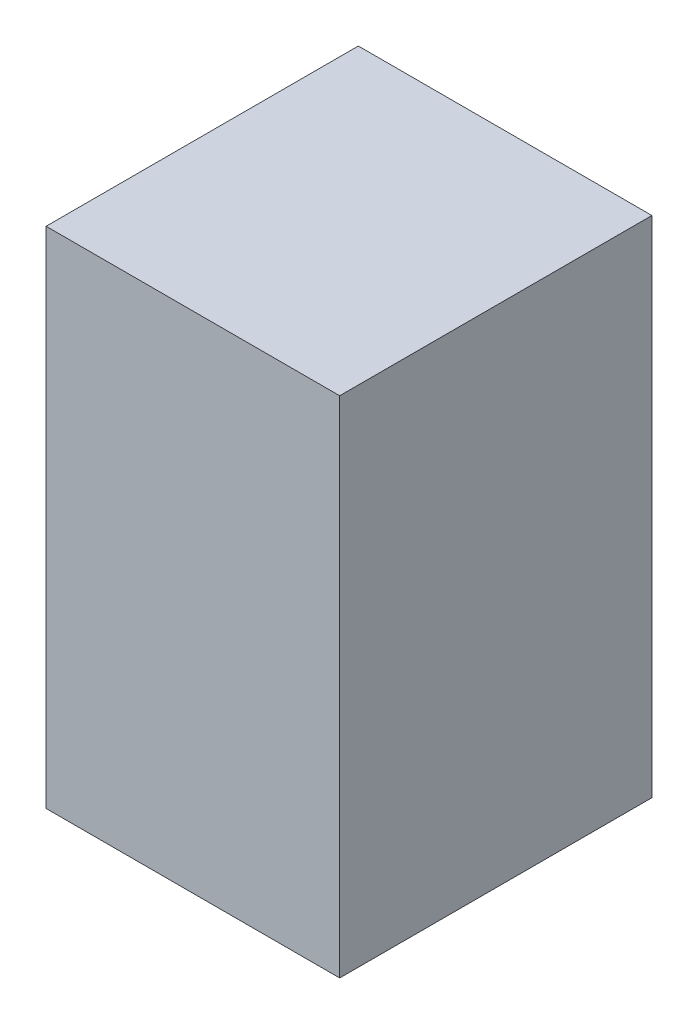
ISO-10303-21;
HEADER;
FILE_DESCRIPTION(('STEP AP214'),'2;1');
FILE_NAME('part.step','',(''),(''),'','','');
FILE_SCHEMA(('AUTOMOTIVE_DESIGN { 1 0 10303 214 1 1 1 1 }'));
ENDSEC;
DATA;
#1=APPLICATION_CONTEXT('core data for automotive mechanical design processes');
#2=APPLICATION_PROTOCOL_DEFINITION('international standard','automotive_design',2000,#1);
#3=PRODUCT_CONTEXT('',#1,'mechanical');
#4=PRODUCT('Part','Part','',(#3));
#5=PRODUCT_RELATED_PRODUCT_CATEGORY('part','',(#4));
#6=PRODUCT_DEFINITION_FORMATION('','',#4);
#7=PRODUCT_DEFINITION_CONTEXT('part definition',#1,'design');
#8=PRODUCT_DEFINITION('design','',#6,#7);
#9=PRODUCT_DEFINITION_SHAPE('','',#8);
#10=(LENGTH_UNIT() NAMED_UNIT(*) SI_UNIT(.MILLI.,.METRE.));
#11=(NAMED_UNIT(*) PLANE_ANGLE_UNIT() SI_UNIT($,.RADIAN.));
#12=(NAMED_UNIT(*) SI_UNIT($,.STERADIAN.) SOLID_ANGLE_UNIT());
#13=UNCERTAINTY_MEASURE_WITH_UNIT(LENGTH_MEASURE(1.E-05),#10,'distance_accuracy_value','');
#14=(GEOMETRIC_REPRESENTATION_CONTEXT(3) GLOBAL_UNCERTAINTY_ASSIGNED_CONTEXT((#13)) GLOBAL_UNIT_ASSIGNED_CONTEXT((#10,
#11,#12)) REPRESENTATION_CONTEXT('',''));
#15=CARTESIAN_POINT('',(0.,0.,0.));
#16=DIRECTION('',(0.,0.,1.));
#17=DIRECTION('',(1.,0.,0.));
#18=AXIS2_PLACEMENT_3D('',#15,#16,#17);
#19=CARTESIAN_POINT('',(-1.3869924,2.3822914,2.94999918));
#20=DIRECTION('',(0.,0.,1.));
#21=DIRECTION('',(1.,0.,0.));
#22=AXIS2_PLACEMENT_3D('',#19,#20,#21);
#23=PLANE('',#22);
#24=DIRECTION('',(0.,1.,0.));
#25=VECTOR('',#24,1.);
#26=CARTESIAN_POINT('',(-1.3869924,-2.3822914,2.94999918));
#27=LINE('',#26,#25);
#28=CARTESIAN_POINT('',(-1.3869924,-2.3822914,2.94999918));
#29=VERTEX_POINT('',#28);
#30=CARTESIAN_POINT('',(-1.3869924,2.3822914,2.94999918));
#31=VERTEX_POINT('',#30);
#32=EDGE_CURVE('E27',#29,#31,#27,.T.);
#33=ORIENTED_EDGE('',*,*,#32,.F.);
#34=DIRECTION('',(-1.,0.,0.));
#35=VECTOR('',#34,1.);
#36=CARTESIAN_POINT('',(1.3869924,-2.3822914,2.94999918));
#37=LINE('',#36,#35);
#38=CARTESIAN_POINT('',(1.3869924,-2.3822914,2.94999918));
#39=VERTEX_POINT('',#38);
#40=EDGE_CURVE('E76',#39,#29,#37,.T.);
#41=ORIENTED_EDGE('',*,*,#40,.F.);
#42=DIRECTION('',(0.,-1.,0.));
#43=VECTOR('',#42,1.);
#44=CARTESIAN_POINT('',(1.3869924,2.3822914,2.94999918));
#45=LINE('',#44,#43);
#46=CARTESIAN_POINT('',(1.3869924,2.3822914,2.94999918));
#47=VERTEX_POINT('',#46);
#48=EDGE_CURVE('E83',#47,#39,#45,.T.);
#49=ORIENTED_EDGE('',*,*,#48,.F.);
#50=DIRECTION('',(1.,0.,0.));
#51=VECTOR('',#50,1.);
#52=CARTESIAN_POINT('',(-1.3869924,2.3822914,2.94999918));
#53=LINE('',#52,#51);
#54=EDGE_CURVE('E86',#31,#47,#53,.T.);
#55=ORIENTED_EDGE('',*,*,#54,.F.);
#56=EDGE_LOOP('',(#33,#41,#49,#55));
#57=FACE_BOUND('',#56,.T.);
#58=ADVANCED_FACE('F16',(#57),#23,.T.);
#59=CARTESIAN_POINT('',(-1.3869924,2.3822914,0.));
#60=DIRECTION('',(0.,0.,1.));
#61=DIRECTION('',(1.,0.,0.));
#62=AXIS2_PLACEMENT_3D('',#59,#60,#61);
#63=PLANE('',#62);
#64=DIRECTION('',(1.,0.,0.));
#65=VECTOR('',#64,1.);
#66=CARTESIAN_POINT('',(-1.3869924,2.3822914,0.));
#67=LINE('',#66,#65);
#68=CARTESIAN_POINT('',(-1.3869924,2.3822914,0.));
#69=VERTEX_POINT('',#68);
#70=CARTESIAN_POINT('',(1.3869924,2.3822914,0.));
#71=VERTEX_POINT('',#70);
#72=EDGE_CURVE('E20',#69,#71,#67,.T.);
#73=ORIENTED_EDGE('',*,*,#72,.T.);
#74=DIRECTION('',(0.,-1.,0.));
#75=VECTOR('',#74,1.);
#76=CARTESIAN_POINT('',(1.3869924,2.3822914,0.));
#77=LINE('',#76,#75);
#78=CARTESIAN_POINT('',(1.3869924,-2.3822914,0.));
#79=VERTEX_POINT('',#78);
#80=EDGE_CURVE('E66',#71,#79,#77,.T.);
#81=ORIENTED_EDGE('',*,*,#80,.T.);
#82=DIRECTION('',(-1.,0.,0.));
#83=VECTOR('',#82,1.);
#84=CARTESIAN_POINT('',(1.3869924,-2.3822914,0.));
#85=LINE('',#84,#83);
#86=CARTESIAN_POINT('',(-1.3869924,-2.3822914,0.));
#87=VERTEX_POINT('',#86);
#88=EDGE_CURVE('E108',#79,#87,#85,.T.);
#89=ORIENTED_EDGE('',*,*,#88,.T.);
#90=DIRECTION('',(0.,1.,0.));
#91=VECTOR('',#90,1.);
#92=CARTESIAN_POINT('',(-1.3869924,-2.3822914,0.));
#93=LINE('',#92,#91);
#94=EDGE_CURVE('E11',#87,#69,#93,.T.);
#95=ORIENTED_EDGE('',*,*,#94,.T.);
#96=EDGE_LOOP('',(#73,#81,#89,#95));
#97=FACE_BOUND('',#96,.T.);
#98=ADVANCED_FACE('F79',(#97),#63,.F.);
#99=CARTESIAN_POINT('',(-1.3869924,-2.3822914,0.));
#100=DIRECTION('',(-1.,0.,0.));
#101=DIRECTION('',(0.,0.,1.));
#102=AXIS2_PLACEMENT_3D('',#99,#100,#101);
#103=PLANE('',#102);
#104=DIRECTION('',(0.,0.,1.));
#105=VECTOR('',#104,1.);
#106=CARTESIAN_POINT('',(-1.3869924,-2.3822914,0.));
#107=LINE('',#106,#105);
#108=EDGE_CURVE('E104',#87,#29,#107,.T.);
#109=ORIENTED_EDGE('',*,*,#108,.T.);
#110=ORIENTED_EDGE('',*,*,#32,.T.);
#111=DIRECTION('',(0.,0.,1.));
#112=VECTOR('',#111,1.);
#113=CARTESIAN_POINT('',(-1.3869924,2.3822914,0.));
#114=LINE('',#113,#112);
#115=EDGE_CURVE('E93',#69,#31,#114,.T.);
#116=ORIENTED_EDGE('',*,*,#115,.F.);
#117=ORIENTED_EDGE('',*,*,#94,.F.);
#118=EDGE_LOOP('',(#109,#110,#116,#117));
#119=FACE_BOUND('',#118,.T.);
#120=ADVANCED_FACE('F102',(#119),#103,.T.);
#121=CARTESIAN_POINT('',(1.3869924,-2.3822914,0.));
#122=DIRECTION('',(0.,-1.,0.));
#123=DIRECTION('',(0.,0.,-1.));
#124=AXIS2_PLACEMENT_3D('',#121,#122,#123);
#125=PLANE('',#124);
#126=DIRECTION('',(0.,0.,1.));
#127=VECTOR('',#126,1.);
#128=CARTESIAN_POINT('',(1.3869924,-2.3822914,0.));
#129=LINE('',#128,#127);
#130=EDGE_CURVE('E73',#79,#39,#129,.T.);
#131=ORIENTED_EDGE('',*,*,#130,.T.);
#132=ORIENTED_EDGE('',*,*,#40,.T.);
#133=ORIENTED_EDGE('',*,*,#108,.F.);
#134=ORIENTED_EDGE('',*,*,#88,.F.);
#135=EDGE_LOOP('',(#131,#132,#133,#134));
#136=FACE_BOUND('',#135,.T.);
#137=ADVANCED_FACE('F129',(#136),#125,.T.);
#138=CARTESIAN_POINT('',(1.3869924,2.3822914,0.));
#139=DIRECTION('',(1.,0.,0.));
#140=DIRECTION('',(0.,1.,0.));
#141=AXIS2_PLACEMENT_3D('',#138,#139,#140);
#142=PLANE('',#141);
#143=DIRECTION('',(0.,0.,1.));
#144=VECTOR('',#143,1.);
#145=CARTESIAN_POINT('',(1.3869924,2.3822914,0.));
#146=LINE('',#145,#144);
#147=EDGE_CURVE('E70',#71,#47,#146,.T.);
#148=ORIENTED_EDGE('',*,*,#147,.T.);
#149=ORIENTED_EDGE('',*,*,#48,.T.);
#150=ORIENTED_EDGE('',*,*,#130,.F.);
#151=ORIENTED_EDGE('',*,*,#80,.F.);
#152=EDGE_LOOP('',(#148,#149,#150,#151));
#153=FACE_BOUND('',#152,.T.);
#154=ADVANCED_FACE('F18',(#153),#142,.T.);
#155=CARTESIAN_POINT('',(-1.3869924,2.3822914,0.));
#156=DIRECTION('',(0.,1.,0.));
#157=DIRECTION('',(1.,0.,0.));
#158=AXIS2_PLACEMENT_3D('',#155,#156,#157);
#159=PLANE('',#158);
#160=ORIENTED_EDGE('',*,*,#115,.T.);
#161=ORIENTED_EDGE('',*,*,#54,.T.);
#162=ORIENTED_EDGE('',*,*,#147,.F.);
#163=ORIENTED_EDGE('',*,*,#72,.F.);
#164=EDGE_LOOP('',(#160,#161,#162,#163));
#165=FACE_BOUND('',#164,.T.);
#166=ADVANCED_FACE('F84',(#165),#159,.T.);
#167=CLOSED_SHELL('',(#58,#98,#120,#137,#154,#166));
#168=MANIFOLD_SOLID_BREP('B1',#167);
#169=ADVANCED_BREP_SHAPE_REPRESENTATION('',(#18,#168),#14);
#170=SHAPE_DEFINITION_REPRESENTATION(#9,#169);
ENDSEC;
END-ISO-10303-21;
